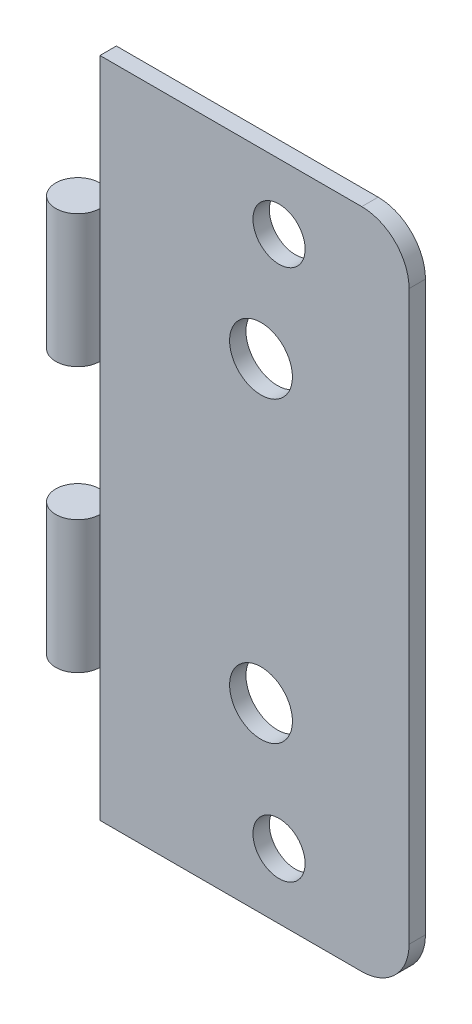
ISO-10303-21;
HEADER;
FILE_DESCRIPTION(('STEP AP214'),'2;1');
FILE_NAME('part.step','',(''),(''),'','','');
FILE_SCHEMA(('AUTOMOTIVE_DESIGN { 1 0 10303 214 1 1 1 1 }'));
ENDSEC;
DATA;
#1=APPLICATION_CONTEXT('core data for automotive mechanical design processes');
#2=APPLICATION_PROTOCOL_DEFINITION('international standard','automotive_design',2000,#1);
#3=PRODUCT_CONTEXT('',#1,'mechanical');
#4=PRODUCT('Part','Part','',(#3));
#5=PRODUCT_RELATED_PRODUCT_CATEGORY('part','',(#4));
#6=PRODUCT_DEFINITION_FORMATION('','',#4);
#7=PRODUCT_DEFINITION_CONTEXT('part definition',#1,'design');
#8=PRODUCT_DEFINITION('design','',#6,#7);
#9=PRODUCT_DEFINITION_SHAPE('','',#8);
#10=(LENGTH_UNIT() NAMED_UNIT(*) SI_UNIT(.MILLI.,.METRE.));
#11=(NAMED_UNIT(*) PLANE_ANGLE_UNIT() SI_UNIT($,.RADIAN.));
#12=(NAMED_UNIT(*) SI_UNIT($,.STERADIAN.) SOLID_ANGLE_UNIT());
#13=UNCERTAINTY_MEASURE_WITH_UNIT(LENGTH_MEASURE(1.E-05),#10,'distance_accuracy_value','');
#14=(GEOMETRIC_REPRESENTATION_CONTEXT(3) GLOBAL_UNCERTAINTY_ASSIGNED_CONTEXT((#13)) GLOBAL_UNIT_ASSIGNED_CONTEXT((#10,
#11,#12)) REPRESENTATION_CONTEXT('',''));
#15=CARTESIAN_POINT('',(0.,0.,0.));
#16=DIRECTION('',(0.,0.,1.));
#17=DIRECTION('',(1.,0.,0.));
#18=AXIS2_PLACEMENT_3D('',#15,#16,#17);
#19=CARTESIAN_POINT('',(0.,44.45,0.));
#20=DIRECTION('',(0.,0.,-1.));
#21=DIRECTION('',(-1.,0.,0.));
#22=AXIS2_PLACEMENT_3D('',#19,#20,#21);
#23=PLANE('',#22);
#24=CARTESIAN_POINT('',(24.58125,20.0103450185321,0.));
#25=DIRECTION('',(0.,0.,1.));
#26=DIRECTION('',(1.,0.,0.));
#27=AXIS2_PLACEMENT_3D('',#24,#25,#26);
#28=CIRCLE('',#27,4.2164);
#29=CARTESIAN_POINT('',(28.79765,20.0103450185321,0.));
#30=VERTEX_POINT('',#29);
#31=EDGE_CURVE('E288',#30,#30,#28,.T.);
#32=ORIENTED_EDGE('',*,*,#31,.F.);
#33=EDGE_LOOP('',(#32));
#34=FACE_BOUND('',#33,.T.);
#35=CARTESIAN_POINT('',(27.,35.7,0.));
#36=DIRECTION('',(0.,0.,1.));
#37=DIRECTION('',(1.,0.,0.));
#38=AXIS2_PLACEMENT_3D('',#35,#36,#37);
#39=CIRCLE('',#38,3.5);
#40=CARTESIAN_POINT('',(30.5,35.7,0.));
#41=VERTEX_POINT('',#40);
#42=EDGE_CURVE('E217',#41,#41,#39,.T.);
#43=ORIENTED_EDGE('',*,*,#42,.F.);
#44=EDGE_LOOP('',(#43));
#45=FACE_BOUND('',#44,.T.);
#46=CARTESIAN_POINT('',(27.,-35.7,0.));
#47=DIRECTION('',(0.,0.,1.));
#48=DIRECTION('',(1.,0.,0.));
#49=AXIS2_PLACEMENT_3D('',#46,#47,#48);
#50=CIRCLE('',#49,3.5);
#51=CARTESIAN_POINT('',(30.5,-35.7,0.));
#52=VERTEX_POINT('',#51);
#53=EDGE_CURVE('E277',#52,#52,#50,.T.);
#54=ORIENTED_EDGE('',*,*,#53,.F.);
#55=EDGE_LOOP('',(#54));
#56=FACE_BOUND('',#55,.T.);
#57=DIRECTION('',(1.,0.,0.));
#58=VECTOR('',#57,1.);
#59=CARTESIAN_POINT('',(0.,-44.45,0.));
#60=LINE('',#59,#58);
#61=CARTESIAN_POINT('',(2.97,-44.45,0.));
#62=VERTEX_POINT('',#61);
#63=CARTESIAN_POINT('',(38.1,-44.45,0.));
#64=VERTEX_POINT('',#63);
#65=EDGE_CURVE('E245',#62,#64,#60,.T.);
#66=ORIENTED_EDGE('',*,*,#65,.T.);
#67=CARTESIAN_POINT('',(38.1,-38.1,0.));
#68=DIRECTION('',(0.,0.,-1.));
#69=DIRECTION('',(-1.,0.,0.));
#70=AXIS2_PLACEMENT_3D('',#67,#68,#69);
#71=CIRCLE('',#70,6.35);
#72=CARTESIAN_POINT('',(44.45,-38.1,0.));
#73=VERTEX_POINT('',#72);
#74=EDGE_CURVE('E63',#64,#73,#71,.F.);
#75=ORIENTED_EDGE('',*,*,#74,.T.);
#76=DIRECTION('',(0.,-1.,0.));
#77=VECTOR('',#76,1.);
#78=CARTESIAN_POINT('',(44.45,44.45,0.));
#79=LINE('',#78,#77);
#80=CARTESIAN_POINT('',(44.45,38.1,0.));
#81=VERTEX_POINT('',#80);
#82=EDGE_CURVE('E250',#81,#73,#79,.T.);
#83=ORIENTED_EDGE('',*,*,#82,.F.);
#84=CARTESIAN_POINT('',(38.1,38.1,0.));
#85=DIRECTION('',(0.,0.,-1.));
#86=DIRECTION('',(-1.,0.,0.));
#87=AXIS2_PLACEMENT_3D('',#84,#85,#86);
#88=CIRCLE('',#87,6.35);
#89=CARTESIAN_POINT('',(38.1,44.45,0.));
#90=VERTEX_POINT('',#89);
#91=EDGE_CURVE('E71',#81,#90,#88,.F.);
#92=ORIENTED_EDGE('',*,*,#91,.T.);
#93=DIRECTION('',(1.,0.,0.));
#94=VECTOR('',#93,1.);
#95=CARTESIAN_POINT('',(0.,44.45,0.));
#96=LINE('',#95,#94);
#97=CARTESIAN_POINT('',(2.97,44.45,0.));
#98=VERTEX_POINT('',#97);
#99=EDGE_CURVE('E244',#98,#90,#96,.T.);
#100=ORIENTED_EDGE('',*,*,#99,.F.);
#101=DIRECTION('',(0.,-1.,0.));
#102=VECTOR('',#101,1.);
#103=CARTESIAN_POINT('',(2.97,44.45,0.));
#104=LINE('',#103,#102);
#105=CARTESIAN_POINT('',(2.97,26.67,0.));
#106=VERTEX_POINT('',#105);
#107=EDGE_CURVE('E179',#98,#106,#104,.T.);
#108=ORIENTED_EDGE('',*,*,#107,.T.);
#109=CARTESIAN_POINT('',(2.97,8.89,0.));
#110=VERTEX_POINT('',#109);
#111=EDGE_CURVE('E153',#106,#110,#104,.T.);
#112=ORIENTED_EDGE('',*,*,#111,.T.);
#113=DIRECTION('',(0.,-1.,0.));
#114=VECTOR('',#113,1.);
#115=CARTESIAN_POINT('',(2.97,44.45,0.));
#116=LINE('',#115,#114);
#117=CARTESIAN_POINT('',(2.97,-8.89,0.));
#118=VERTEX_POINT('',#117);
#119=EDGE_CURVE('E162',#110,#118,#116,.T.);
#120=ORIENTED_EDGE('',*,*,#119,.T.);
#121=CARTESIAN_POINT('',(2.97,-26.67,0.));
#122=VERTEX_POINT('',#121);
#123=EDGE_CURVE('E180',#118,#122,#104,.T.);
#124=ORIENTED_EDGE('',*,*,#123,.T.);
#125=DIRECTION('',(0.,-1.,0.));
#126=VECTOR('',#125,1.);
#127=CARTESIAN_POINT('',(2.96999999999999,44.45,0.));
#128=LINE('',#127,#126);
#129=EDGE_CURVE('E235',#122,#62,#128,.T.);
#130=ORIENTED_EDGE('',*,*,#129,.T.);
#131=EDGE_LOOP('',(#66,#75,#83,#92,#100,#108,#112,#120,#124,#130));
#132=FACE_BOUND('',#131,.T.);
#133=CARTESIAN_POINT('',(24.58125,-20.0103450185321,0.));
#134=DIRECTION('',(0.,0.,1.));
#135=DIRECTION('',(1.,0.,0.));
#136=AXIS2_PLACEMENT_3D('',#133,#134,#135);
#137=CIRCLE('',#136,4.2164);
#138=CARTESIAN_POINT('',(28.79765,-20.0103450185321,0.));
#139=VERTEX_POINT('',#138);
#140=EDGE_CURVE('E285',#139,#139,#137,.T.);
#141=ORIENTED_EDGE('',*,*,#140,.F.);
#142=EDGE_LOOP('',(#141));
#143=FACE_BOUND('',#142,.T.);
#144=ADVANCED_FACE('F54',(#34,#45,#56,#132,#143),#23,.F.);
#145=CARTESIAN_POINT('',(0.,44.45,0.));
#146=DIRECTION('',(0.,-1.,0.));
#147=DIRECTION('',(0.,0.,-1.));
#148=AXIS2_PLACEMENT_3D('',#145,#146,#147);
#149=CYLINDRICAL_SURFACE('',#148,2.97);
#150=CARTESIAN_POINT('',(0.,26.67,0.));
#151=DIRECTION('',(0.,-1.,0.));
#152=DIRECTION('',(0.,0.,-1.));
#153=AXIS2_PLACEMENT_3D('',#150,#151,#152);
#154=CIRCLE('',#153,2.97);
#155=CARTESIAN_POINT('',(1.99521928619388,26.67,-2.2));
#156=VERTEX_POINT('',#155);
#157=EDGE_CURVE('E233',#106,#156,#154,.T.);
#158=ORIENTED_EDGE('',*,*,#157,.T.);
#159=DIRECTION('',(0.,-1.,0.));
#160=VECTOR('',#159,1.);
#161=CARTESIAN_POINT('',(1.99521928619388,44.45,-2.2));
#162=LINE('',#161,#160);
#163=CARTESIAN_POINT('',(1.99521928619388,8.89,-2.2));
#164=VERTEX_POINT('',#163);
#165=EDGE_CURVE('E156',#156,#164,#162,.T.);
#166=ORIENTED_EDGE('',*,*,#165,.T.);
#167=CARTESIAN_POINT('',(0.,8.89,0.));
#168=DIRECTION('',(0.,1.,0.));
#169=DIRECTION('',(0.,0.,1.));
#170=AXIS2_PLACEMENT_3D('',#167,#168,#169);
#171=CIRCLE('',#170,2.97);
#172=EDGE_CURVE('E149',#164,#110,#171,.T.);
#173=ORIENTED_EDGE('',*,*,#172,.T.);
#174=ORIENTED_EDGE('',*,*,#111,.F.);
#175=EDGE_LOOP('',(#158,#166,#173,#174));
#176=FACE_BOUND('',#175,.T.);
#177=ADVANCED_FACE('F151',(#176),#149,.T.);
#178=CARTESIAN_POINT('',(0.,-26.67,0.));
#179=DIRECTION('',(0.,1.,0.));
#180=DIRECTION('',(0.,0.,1.));
#181=AXIS2_PLACEMENT_3D('',#178,#179,#180);
#182=CIRCLE('',#181,2.97);
#183=CARTESIAN_POINT('',(1.99521928619388,-26.67,-2.2));
#184=VERTEX_POINT('',#183);
#185=EDGE_CURVE('E238',#184,#122,#182,.T.);
#186=ORIENTED_EDGE('',*,*,#185,.T.);
#187=ORIENTED_EDGE('',*,*,#123,.F.);
#188=CARTESIAN_POINT('',(0.,-8.89,0.));
#189=DIRECTION('',(0.,-1.,0.));
#190=DIRECTION('',(0.,0.,-1.));
#191=AXIS2_PLACEMENT_3D('',#188,#189,#190);
#192=CIRCLE('',#191,2.97);
#193=CARTESIAN_POINT('',(1.99521928619388,-8.89,-2.2));
#194=VERTEX_POINT('',#193);
#195=EDGE_CURVE('E161',#118,#194,#192,.T.);
#196=ORIENTED_EDGE('',*,*,#195,.T.);
#197=EDGE_CURVE('E185',#194,#184,#162,.T.);
#198=ORIENTED_EDGE('',*,*,#197,.T.);
#199=EDGE_LOOP('',(#186,#187,#196,#198));
#200=FACE_BOUND('',#199,.T.);
#201=ADVANCED_FACE('F320',(#200),#149,.T.);
#202=CARTESIAN_POINT('',(0.,-44.45,0.));
#203=DIRECTION('',(0.,1.,0.));
#204=DIRECTION('',(0.,0.,1.));
#205=AXIS2_PLACEMENT_3D('',#202,#203,#204);
#206=PLANE('',#205);
#207=DIRECTION('',(1.,0.,0.));
#208=VECTOR('',#207,1.);
#209=CARTESIAN_POINT('',(0.,-44.45,-2.2));
#210=LINE('',#209,#208);
#211=CARTESIAN_POINT('',(2.97,-44.45,-2.2));
#212=VERTEX_POINT('',#211);
#213=CARTESIAN_POINT('',(38.1,-44.45,-2.2));
#214=VERTEX_POINT('',#213);
#215=EDGE_CURVE('E240',#212,#214,#210,.T.);
#216=ORIENTED_EDGE('',*,*,#215,.T.);
#217=DIRECTION('',(0.,0.,-1.));
#218=VECTOR('',#217,1.);
#219=CARTESIAN_POINT('',(38.1,-44.45,0.));
#220=LINE('',#219,#218);
#221=EDGE_CURVE('E79',#214,#64,#220,.F.);
#222=ORIENTED_EDGE('',*,*,#221,.T.);
#223=ORIENTED_EDGE('',*,*,#65,.F.);
#224=DIRECTION('',(0.,0.,1.));
#225=VECTOR('',#224,1.);
#226=CARTESIAN_POINT('',(2.97,-44.45,-2.97));
#227=LINE('',#226,#225);
#228=EDGE_CURVE('E223',#212,#62,#227,.T.);
#229=ORIENTED_EDGE('',*,*,#228,.F.);
#230=EDGE_LOOP('',(#216,#222,#223,#229));
#231=FACE_BOUND('',#230,.T.);
#232=ADVANCED_FACE('F340',(#231),#206,.F.);
#233=CARTESIAN_POINT('',(0.,44.45,0.));
#234=DIRECTION('',(0.,1.,0.));
#235=DIRECTION('',(0.,0.,1.));
#236=AXIS2_PLACEMENT_3D('',#233,#234,#235);
#237=PLANE('',#236);
#238=ORIENTED_EDGE('',*,*,#99,.T.);
#239=DIRECTION('',(0.,0.,-1.));
#240=VECTOR('',#239,1.);
#241=CARTESIAN_POINT('',(38.1,44.45,-2.2));
#242=LINE('',#241,#240);
#243=CARTESIAN_POINT('',(38.1,44.45,-2.2));
#244=VERTEX_POINT('',#243);
#245=EDGE_CURVE('E12',#90,#244,#242,.T.);
#246=ORIENTED_EDGE('',*,*,#245,.T.);
#247=DIRECTION('',(1.,0.,0.));
#248=VECTOR('',#247,1.);
#249=CARTESIAN_POINT('',(0.,44.45,-2.2));
#250=LINE('',#249,#248);
#251=CARTESIAN_POINT('',(2.97,44.45,-2.2));
#252=VERTEX_POINT('',#251);
#253=EDGE_CURVE('E241',#252,#244,#250,.T.);
#254=ORIENTED_EDGE('',*,*,#253,.F.);
#255=DIRECTION('',(0.,0.,1.));
#256=VECTOR('',#255,1.);
#257=CARTESIAN_POINT('',(2.97,44.45,-2.97));
#258=LINE('',#257,#256);
#259=EDGE_CURVE('E226',#252,#98,#258,.T.);
#260=ORIENTED_EDGE('',*,*,#259,.T.);
#261=EDGE_LOOP('',(#238,#246,#254,#260));
#262=FACE_BOUND('',#261,.T.);
#263=ADVANCED_FACE('F265',(#262),#237,.T.);
#264=CARTESIAN_POINT('',(44.45,44.45,0.));
#265=DIRECTION('',(-1.,0.,0.));
#266=DIRECTION('',(0.,0.,1.));
#267=AXIS2_PLACEMENT_3D('',#264,#265,#266);
#268=PLANE('',#267);
#269=ORIENTED_EDGE('',*,*,#82,.T.);
#270=DIRECTION('',(0.,0.,-1.));
#271=VECTOR('',#270,1.);
#272=CARTESIAN_POINT('',(44.45,-38.1,0.));
#273=LINE('',#272,#271);
#274=CARTESIAN_POINT('',(44.45,-38.1,-2.2));
#275=VERTEX_POINT('',#274);
#276=EDGE_CURVE('E204',#73,#275,#273,.T.);
#277=ORIENTED_EDGE('',*,*,#276,.T.);
#278=DIRECTION('',(0.,-1.,0.));
#279=VECTOR('',#278,1.);
#280=CARTESIAN_POINT('',(44.45,44.45,-2.2));
#281=LINE('',#280,#279);
#282=CARTESIAN_POINT('',(44.45,38.1,-2.2));
#283=VERTEX_POINT('',#282);
#284=EDGE_CURVE('E247',#283,#275,#281,.T.);
#285=ORIENTED_EDGE('',*,*,#284,.F.);
#286=DIRECTION('',(0.,0.,-1.));
#287=VECTOR('',#286,1.);
#288=CARTESIAN_POINT('',(44.45,38.1,0.));
#289=LINE('',#288,#287);
#290=EDGE_CURVE('E202',#283,#81,#289,.F.);
#291=ORIENTED_EDGE('',*,*,#290,.T.);
#292=EDGE_LOOP('',(#269,#277,#285,#291));
#293=FACE_BOUND('',#292,.T.);
#294=ADVANCED_FACE('F259',(#293),#268,.F.);
#295=CARTESIAN_POINT('',(0.,44.45,-2.2));
#296=DIRECTION('',(0.,0.,-1.));
#297=DIRECTION('',(-1.,0.,0.));
#298=AXIS2_PLACEMENT_3D('',#295,#296,#297);
#299=PLANE('',#298);
#300=CARTESIAN_POINT('',(24.58125,20.0103450185321,-2.2));
#301=DIRECTION('',(0.,0.,-1.));
#302=DIRECTION('',(-1.,0.,0.));
#303=AXIS2_PLACEMENT_3D('',#300,#301,#302);
#304=CIRCLE('',#303,4.2164);
#305=CARTESIAN_POINT('',(20.36485,20.0103450185321,-2.2));
#306=VERTEX_POINT('',#305);
#307=EDGE_CURVE('E58',#306,#306,#304,.T.);
#308=ORIENTED_EDGE('',*,*,#307,.F.);
#309=EDGE_LOOP('',(#308));
#310=FACE_BOUND('',#309,.T.);
#311=CARTESIAN_POINT('',(24.58125,-20.0103450185321,-2.2));
#312=DIRECTION('',(0.,0.,-1.));
#313=DIRECTION('',(-1.,0.,0.));
#314=AXIS2_PLACEMENT_3D('',#311,#312,#313);
#315=CIRCLE('',#314,4.2164);
#316=CARTESIAN_POINT('',(20.36485,-20.0103450185321,-2.2));
#317=VERTEX_POINT('',#316);
#318=EDGE_CURVE('E280',#317,#317,#315,.T.);
#319=ORIENTED_EDGE('',*,*,#318,.F.);
#320=EDGE_LOOP('',(#319));
#321=FACE_BOUND('',#320,.T.);
#322=CARTESIAN_POINT('',(27.,35.7,-2.2));
#323=DIRECTION('',(0.,0.,-1.));
#324=DIRECTION('',(-1.,0.,0.));
#325=AXIS2_PLACEMENT_3D('',#322,#323,#324);
#326=CIRCLE('',#325,3.5);
#327=CARTESIAN_POINT('',(23.5,35.7,-2.2));
#328=VERTEX_POINT('',#327);
#329=EDGE_CURVE('E216',#328,#328,#326,.T.);
#330=ORIENTED_EDGE('',*,*,#329,.F.);
#331=EDGE_LOOP('',(#330));
#332=FACE_BOUND('',#331,.T.);
#333=CARTESIAN_POINT('',(27.,-35.7,-2.2));
#334=DIRECTION('',(0.,0.,-1.));
#335=DIRECTION('',(-1.,0.,0.));
#336=AXIS2_PLACEMENT_3D('',#333,#334,#335);
#337=CIRCLE('',#336,3.5);
#338=CARTESIAN_POINT('',(23.5,-35.7,-2.2));
#339=VERTEX_POINT('',#338);
#340=EDGE_CURVE('E214',#339,#339,#337,.T.);
#341=ORIENTED_EDGE('',*,*,#340,.F.);
#342=EDGE_LOOP('',(#341));
#343=FACE_BOUND('',#342,.T.);
#344=ORIENTED_EDGE('',*,*,#284,.T.);
#345=CARTESIAN_POINT('',(38.1,-38.1,-2.2));
#346=DIRECTION('',(0.,0.,-1.));
#347=DIRECTION('',(-1.,0.,0.));
#348=AXIS2_PLACEMENT_3D('',#345,#346,#347);
#349=CIRCLE('',#348,6.35);
#350=EDGE_CURVE('E209',#275,#214,#349,.T.);
#351=ORIENTED_EDGE('',*,*,#350,.T.);
#352=ORIENTED_EDGE('',*,*,#215,.F.);
#353=DIRECTION('',(0.,-1.,0.));
#354=VECTOR('',#353,1.);
#355=CARTESIAN_POINT('',(2.96999999999999,44.45,-2.2));
#356=LINE('',#355,#354);
#357=CARTESIAN_POINT('',(2.97,-26.67,-2.2));
#358=VERTEX_POINT('',#357);
#359=EDGE_CURVE('E197',#358,#212,#356,.T.);
#360=ORIENTED_EDGE('',*,*,#359,.F.);
#361=DIRECTION('',(1.,0.,0.));
#362=VECTOR('',#361,1.);
#363=CARTESIAN_POINT('',(0.,-26.67,-2.2));
#364=LINE('',#363,#362);
#365=EDGE_CURVE('E199',#184,#358,#364,.T.);
#366=ORIENTED_EDGE('',*,*,#365,.F.);
#367=ORIENTED_EDGE('',*,*,#197,.F.);
#368=DIRECTION('',(-1.,0.,0.));
#369=VECTOR('',#368,1.);
#370=CARTESIAN_POINT('',(0.,-8.89,-2.2));
#371=LINE('',#370,#369);
#372=CARTESIAN_POINT('',(2.97,-8.89,-2.2));
#373=VERTEX_POINT('',#372);
#374=EDGE_CURVE('E189',#373,#194,#371,.T.);
#375=ORIENTED_EDGE('',*,*,#374,.F.);
#376=DIRECTION('',(0.,-1.,0.));
#377=VECTOR('',#376,1.);
#378=CARTESIAN_POINT('',(2.97,44.45,-2.2));
#379=LINE('',#378,#377);
#380=CARTESIAN_POINT('',(2.97,8.89,-2.2));
#381=VERTEX_POINT('',#380);
#382=EDGE_CURVE('E182',#381,#373,#379,.T.);
#383=ORIENTED_EDGE('',*,*,#382,.F.);
#384=DIRECTION('',(1.,0.,0.));
#385=VECTOR('',#384,1.);
#386=CARTESIAN_POINT('',(0.,8.89,-2.2));
#387=LINE('',#386,#385);
#388=EDGE_CURVE('E175',#164,#381,#387,.T.);
#389=ORIENTED_EDGE('',*,*,#388,.F.);
#390=ORIENTED_EDGE('',*,*,#165,.F.);
#391=DIRECTION('',(-1.,0.,0.));
#392=VECTOR('',#391,1.);
#393=CARTESIAN_POINT('',(0.,26.67,-2.2));
#394=LINE('',#393,#392);
#395=CARTESIAN_POINT('',(2.97,26.67,-2.2));
#396=VERTEX_POINT('',#395);
#397=EDGE_CURVE('E194',#396,#156,#394,.T.);
#398=ORIENTED_EDGE('',*,*,#397,.F.);
#399=DIRECTION('',(0.,-1.,0.));
#400=VECTOR('',#399,1.);
#401=CARTESIAN_POINT('',(2.97,44.45,-2.2));
#402=LINE('',#401,#400);
#403=EDGE_CURVE('E192',#252,#396,#402,.T.);
#404=ORIENTED_EDGE('',*,*,#403,.F.);
#405=ORIENTED_EDGE('',*,*,#253,.T.);
#406=CARTESIAN_POINT('',(38.1,38.1,-2.2));
#407=DIRECTION('',(0.,0.,-1.));
#408=DIRECTION('',(-1.,0.,0.));
#409=AXIS2_PLACEMENT_3D('',#406,#407,#408);
#410=CIRCLE('',#409,6.35);
#411=EDGE_CURVE('E207',#244,#283,#410,.T.);
#412=ORIENTED_EDGE('',*,*,#411,.T.);
#413=EDGE_LOOP('',(#344,#351,#352,#360,#366,#367,#375,#383,#389,#390,#398,#404,#405,#412));
#414=FACE_BOUND('',#413,.T.);
#415=ADVANCED_FACE('F255',(#310,#321,#332,#343,#414),#299,.T.);
#416=CARTESIAN_POINT('',(-2.97,-8.89,-2.97));
#417=DIRECTION('',(0.,-1.,0.));
#418=DIRECTION('',(0.,0.,-1.));
#419=AXIS2_PLACEMENT_3D('',#416,#417,#418);
#420=PLANE('',#419);
#421=DIRECTION('',(0.,0.,1.));
#422=VECTOR('',#421,1.);
#423=CARTESIAN_POINT('',(2.97,-8.89,-2.97));
#424=LINE('',#423,#422);
#425=EDGE_CURVE('E170',#373,#118,#424,.T.);
#426=ORIENTED_EDGE('',*,*,#425,.F.);
#427=ORIENTED_EDGE('',*,*,#374,.T.);
#428=ORIENTED_EDGE('',*,*,#195,.F.);
#429=EDGE_LOOP('',(#426,#427,#428));
#430=FACE_BOUND('',#429,.T.);
#431=ADVANCED_FACE('F299',(#430),#420,.F.);
#432=CARTESIAN_POINT('',(-2.97,8.89,-2.97));
#433=DIRECTION('',(0.,1.,0.));
#434=DIRECTION('',(0.,0.,1.));
#435=AXIS2_PLACEMENT_3D('',#432,#433,#434);
#436=PLANE('',#435);
#437=ORIENTED_EDGE('',*,*,#172,.F.);
#438=ORIENTED_EDGE('',*,*,#388,.T.);
#439=DIRECTION('',(0.,0.,1.));
#440=VECTOR('',#439,1.);
#441=CARTESIAN_POINT('',(2.97,8.89,-2.97));
#442=LINE('',#441,#440);
#443=EDGE_CURVE('E168',#381,#110,#442,.T.);
#444=ORIENTED_EDGE('',*,*,#443,.T.);
#445=EDGE_LOOP('',(#437,#438,#444));
#446=FACE_BOUND('',#445,.T.);
#447=ADVANCED_FACE('F174',(#446),#436,.F.);
#448=CARTESIAN_POINT('',(2.97,8.89,-2.97));
#449=DIRECTION('',(1.,0.,0.));
#450=DIRECTION('',(0.,0.,-1.));
#451=AXIS2_PLACEMENT_3D('',#448,#449,#450);
#452=PLANE('',#451);
#453=ORIENTED_EDGE('',*,*,#443,.F.);
#454=ORIENTED_EDGE('',*,*,#382,.T.);
#455=ORIENTED_EDGE('',*,*,#425,.T.);
#456=ORIENTED_EDGE('',*,*,#119,.F.);
#457=EDGE_LOOP('',(#453,#454,#455,#456));
#458=FACE_BOUND('',#457,.T.);
#459=ADVANCED_FACE('F167',(#458),#452,.F.);
#460=CARTESIAN_POINT('',(-2.97,26.67,-2.97));
#461=DIRECTION('',(0.,-1.,0.));
#462=DIRECTION('',(0.,0.,-1.));
#463=AXIS2_PLACEMENT_3D('',#460,#461,#462);
#464=PLANE('',#463);
#465=DIRECTION('',(0.,0.,1.));
#466=VECTOR('',#465,1.);
#467=CARTESIAN_POINT('',(2.97,26.67,-2.97));
#468=LINE('',#467,#466);
#469=EDGE_CURVE('E230',#396,#106,#468,.T.);
#470=ORIENTED_EDGE('',*,*,#469,.F.);
#471=ORIENTED_EDGE('',*,*,#397,.T.);
#472=ORIENTED_EDGE('',*,*,#157,.F.);
#473=EDGE_LOOP('',(#470,#471,#472));
#474=FACE_BOUND('',#473,.T.);
#475=ADVANCED_FACE('F274',(#474),#464,.F.);
#476=CARTESIAN_POINT('',(2.97,44.45,-2.97));
#477=DIRECTION('',(1.,0.,0.));
#478=DIRECTION('',(0.,0.,-1.));
#479=AXIS2_PLACEMENT_3D('',#476,#477,#478);
#480=PLANE('',#479);
#481=ORIENTED_EDGE('',*,*,#259,.F.);
#482=ORIENTED_EDGE('',*,*,#403,.T.);
#483=ORIENTED_EDGE('',*,*,#469,.T.);
#484=ORIENTED_EDGE('',*,*,#107,.F.);
#485=EDGE_LOOP('',(#481,#482,#483,#484));
#486=FACE_BOUND('',#485,.T.);
#487=ADVANCED_FACE('F272',(#486),#480,.F.);
#488=CARTESIAN_POINT('',(-2.97,-26.67,-2.97));
#489=DIRECTION('',(0.,1.,0.));
#490=DIRECTION('',(0.,0.,1.));
#491=AXIS2_PLACEMENT_3D('',#488,#489,#490);
#492=PLANE('',#491);
#493=ORIENTED_EDGE('',*,*,#185,.F.);
#494=ORIENTED_EDGE('',*,*,#365,.T.);
#495=DIRECTION('',(0.,0.,1.));
#496=VECTOR('',#495,1.);
#497=CARTESIAN_POINT('',(2.97,-26.67,-2.97));
#498=LINE('',#497,#496);
#499=EDGE_CURVE('E219',#358,#122,#498,.T.);
#500=ORIENTED_EDGE('',*,*,#499,.T.);
#501=EDGE_LOOP('',(#493,#494,#500));
#502=FACE_BOUND('',#501,.T.);
#503=ADVANCED_FACE('F334',(#502),#492,.F.);
#504=CARTESIAN_POINT('',(2.97,-26.67,-2.97));
#505=DIRECTION('',(1.,0.,0.));
#506=DIRECTION('',(0.,1.,0.));
#507=AXIS2_PLACEMENT_3D('',#504,#505,#506);
#508=PLANE('',#507);
#509=ORIENTED_EDGE('',*,*,#499,.F.);
#510=ORIENTED_EDGE('',*,*,#359,.T.);
#511=ORIENTED_EDGE('',*,*,#228,.T.);
#512=ORIENTED_EDGE('',*,*,#129,.F.);
#513=EDGE_LOOP('',(#509,#510,#511,#512));
#514=FACE_BOUND('',#513,.T.);
#515=ADVANCED_FACE('F328',(#514),#508,.F.);
#516=CARTESIAN_POINT('',(38.1,-38.1,0.));
#517=DIRECTION('',(0.,0.,-1.));
#518=DIRECTION('',(-1.,0.,0.));
#519=AXIS2_PLACEMENT_3D('',#516,#517,#518);
#520=CYLINDRICAL_SURFACE('',#519,6.35);
#521=ORIENTED_EDGE('',*,*,#74,.F.);
#522=ORIENTED_EDGE('',*,*,#221,.F.);
#523=ORIENTED_EDGE('',*,*,#350,.F.);
#524=ORIENTED_EDGE('',*,*,#276,.F.);
#525=EDGE_LOOP('',(#521,#522,#523,#524));
#526=FACE_BOUND('',#525,.T.);
#527=ADVANCED_FACE('F326',(#526),#520,.T.);
#528=CARTESIAN_POINT('',(38.1,38.1,0.));
#529=DIRECTION('',(0.,0.,1.));
#530=DIRECTION('',(1.,0.,0.));
#531=AXIS2_PLACEMENT_3D('',#528,#529,#530);
#532=CYLINDRICAL_SURFACE('',#531,6.35);
#533=ORIENTED_EDGE('',*,*,#91,.F.);
#534=ORIENTED_EDGE('',*,*,#290,.F.);
#535=ORIENTED_EDGE('',*,*,#411,.F.);
#536=ORIENTED_EDGE('',*,*,#245,.F.);
#537=EDGE_LOOP('',(#533,#534,#535,#536));
#538=FACE_BOUND('',#537,.T.);
#539=ADVANCED_FACE('F56',(#538),#532,.T.);
#540=CARTESIAN_POINT('',(27.,-35.7,-2.97));
#541=DIRECTION('',(0.,0.,1.));
#542=DIRECTION('',(1.,0.,0.));
#543=AXIS2_PLACEMENT_3D('',#540,#541,#542);
#544=CYLINDRICAL_SURFACE('',#543,3.5);
#545=ORIENTED_EDGE('',*,*,#340,.T.);
#546=EDGE_LOOP('',(#545));
#547=FACE_BOUND('',#546,.T.);
#548=ORIENTED_EDGE('',*,*,#53,.T.);
#549=EDGE_LOOP('',(#548));
#550=FACE_BOUND('',#549,.T.);
#551=ADVANCED_FACE('F306',(#547,#550),#544,.F.);
#552=CARTESIAN_POINT('',(27.,35.7,-2.97));
#553=DIRECTION('',(0.,0.,1.));
#554=DIRECTION('',(1.,0.,0.));
#555=AXIS2_PLACEMENT_3D('',#552,#553,#554);
#556=CYLINDRICAL_SURFACE('',#555,3.5);
#557=ORIENTED_EDGE('',*,*,#329,.T.);
#558=EDGE_LOOP('',(#557));
#559=FACE_BOUND('',#558,.T.);
#560=ORIENTED_EDGE('',*,*,#42,.T.);
#561=EDGE_LOOP('',(#560));
#562=FACE_BOUND('',#561,.T.);
#563=ADVANCED_FACE('F309',(#559,#562),#556,.F.);
#564=CARTESIAN_POINT('',(24.58125,-20.0103450185321,0.));
#565=DIRECTION('',(0.,0.,1.));
#566=DIRECTION('',(1.,0.,0.));
#567=AXIS2_PLACEMENT_3D('',#564,#565,#566);
#568=CYLINDRICAL_SURFACE('',#567,4.2164);
#569=ORIENTED_EDGE('',*,*,#318,.T.);
#570=EDGE_LOOP('',(#569));
#571=FACE_BOUND('',#570,.T.);
#572=ORIENTED_EDGE('',*,*,#140,.T.);
#573=EDGE_LOOP('',(#572));
#574=FACE_BOUND('',#573,.T.);
#575=ADVANCED_FACE('F441',(#571,#574),#568,.F.);
#576=CARTESIAN_POINT('',(24.58125,20.0103450185321,0.));
#577=DIRECTION('',(0.,0.,1.));
#578=DIRECTION('',(1.,0.,0.));
#579=AXIS2_PLACEMENT_3D('',#576,#577,#578);
#580=CYLINDRICAL_SURFACE('',#579,4.2164);
#581=ORIENTED_EDGE('',*,*,#307,.T.);
#582=EDGE_LOOP('',(#581));
#583=FACE_BOUND('',#582,.T.);
#584=ORIENTED_EDGE('',*,*,#31,.T.);
#585=EDGE_LOOP('',(#584));
#586=FACE_BOUND('',#585,.T.);
#587=ADVANCED_FACE('F295',(#583,#586),#580,.F.);
#588=CLOSED_SHELL('',(#144,#177,#201,#232,#263,#294,#415,#431,#447,#459,#475,#487,#503,#515,
#527,#539,#551,#563,#575,#587));
#589=MANIFOLD_SOLID_BREP('B2',#588);
#590=ADVANCED_BREP_SHAPE_REPRESENTATION('',(#18,#589),#14);
#591=SHAPE_DEFINITION_REPRESENTATION(#9,#590);
ENDSEC;
END-ISO-10303-21;
